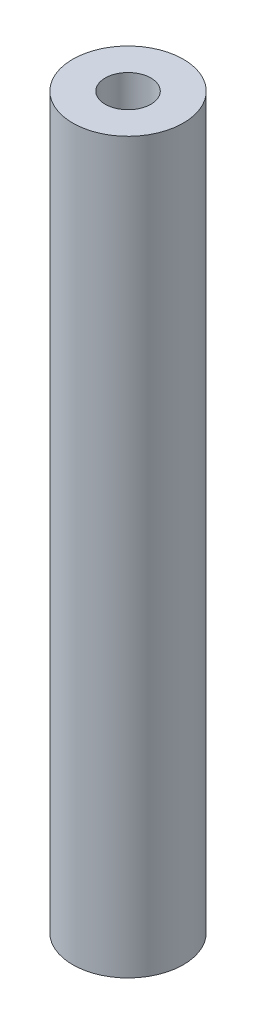
ISO-10303-21;
HEADER;
FILE_DESCRIPTION(('STEP AP214'),'2;1');
FILE_NAME('part.step','',(''),(''),'','','');
FILE_SCHEMA(('AUTOMOTIVE_DESIGN { 1 0 10303 214 1 1 1 1 }'));
ENDSEC;
DATA;
#1=APPLICATION_CONTEXT('core data for automotive mechanical design processes');
#2=APPLICATION_PROTOCOL_DEFINITION('international standard','automotive_design',2000,#1);
#3=PRODUCT_CONTEXT('',#1,'mechanical');
#4=PRODUCT('Part','Part','',(#3));
#5=PRODUCT_RELATED_PRODUCT_CATEGORY('part','',(#4));
#6=PRODUCT_DEFINITION_FORMATION('','',#4);
#7=PRODUCT_DEFINITION_CONTEXT('part definition',#1,'design');
#8=PRODUCT_DEFINITION('design','',#6,#7);
#9=PRODUCT_DEFINITION_SHAPE('','',#8);
#10=(LENGTH_UNIT() NAMED_UNIT(*) SI_UNIT(.MILLI.,.METRE.));
#11=(NAMED_UNIT(*) PLANE_ANGLE_UNIT() SI_UNIT($,.RADIAN.));
#12=(NAMED_UNIT(*) SI_UNIT($,.STERADIAN.) SOLID_ANGLE_UNIT());
#13=UNCERTAINTY_MEASURE_WITH_UNIT(LENGTH_MEASURE(1.E-05),#10,'distance_accuracy_value','');
#14=(GEOMETRIC_REPRESENTATION_CONTEXT(3) GLOBAL_UNCERTAINTY_ASSIGNED_CONTEXT((#13)) GLOBAL_UNIT_ASSIGNED_CONTEXT((#10,
#11,#12)) REPRESENTATION_CONTEXT('',''));
#15=CARTESIAN_POINT('',(0.,0.,0.));
#16=DIRECTION('',(0.,0.,1.));
#17=DIRECTION('',(1.,0.,0.));
#18=AXIS2_PLACEMENT_3D('',#15,#16,#17);
#19=CARTESIAN_POINT('',(0.,26.35,0.));
#20=DIRECTION('',(0.,-1.,0.));
#21=DIRECTION('',(0.,0.,-1.));
#22=AXIS2_PLACEMENT_3D('',#19,#20,#21);
#23=CYLINDRICAL_SURFACE('',#22,4.);
#24=CARTESIAN_POINT('',(0.,26.35,0.));
#25=DIRECTION('',(0.,1.,0.));
#26=DIRECTION('',(0.,0.,1.));
#27=AXIS2_PLACEMENT_3D('',#24,#25,#26);
#28=CIRCLE('',#27,4.);
#29=CARTESIAN_POINT('',(0.,26.35,-4.));
#30=VERTEX_POINT('',#29);
#31=EDGE_CURVE('E11',#30,#30,#28,.T.);
#32=CARTESIAN_POINT('',(0.,-26.35,0.));
#33=DIRECTION('',(0.,1.,0.));
#34=DIRECTION('',(0.,0.,1.));
#35=AXIS2_PLACEMENT_3D('',#32,#33,#34);
#36=CIRCLE('',#35,4.);
#37=CARTESIAN_POINT('',(0.,-26.35,-4.));
#38=VERTEX_POINT('',#37);
#39=EDGE_CURVE('E58',#38,#38,#36,.T.);
#40=CARTESIAN_POINT('',(0.,26.35,-4.));
#41=CARTESIAN_POINT('',(0.,25.8010416666667,-4.));
#42=CARTESIAN_POINT('',(0.,25.2520833333333,-4.));
#43=CARTESIAN_POINT('',(0.,24.1541666666667,-4.));
#44=CARTESIAN_POINT('',(0.,23.6052083333333,-4.));
#45=CARTESIAN_POINT('',(0.,22.5072916666667,-4.));
#46=CARTESIAN_POINT('',(0.,21.9583333333333,-4.));
#47=CARTESIAN_POINT('',(0.,20.8604166666667,-4.));
#48=CARTESIAN_POINT('',(0.,20.3114583333333,-4.));
#49=CARTESIAN_POINT('',(0.,19.2135416666667,-4.));
#50=CARTESIAN_POINT('',(0.,18.6645833333333,-4.));
#51=CARTESIAN_POINT('',(0.,17.5666666666667,-4.));
#52=CARTESIAN_POINT('',(0.,17.0177083333333,-4.));
#53=CARTESIAN_POINT('',(0.,15.9197916666667,-4.));
#54=CARTESIAN_POINT('',(0.,15.3708333333333,-4.));
#55=CARTESIAN_POINT('',(0.,14.2729166666667,-4.));
#56=CARTESIAN_POINT('',(0.,13.7239583333333,-4.));
#57=CARTESIAN_POINT('',(0.,12.6260416666667,-4.));
#58=CARTESIAN_POINT('',(0.,12.0770833333333,-4.));
#59=CARTESIAN_POINT('',(0.,10.9791666666667,-4.));
#60=CARTESIAN_POINT('',(0.,10.4302083333333,-4.));
#61=CARTESIAN_POINT('',(0.,9.33229166666667,-4.));
#62=CARTESIAN_POINT('',(0.,8.78333333333333,-4.));
#63=CARTESIAN_POINT('',(0.,7.68541666666667,-4.));
#64=CARTESIAN_POINT('',(0.,7.13645833333334,-4.));
#65=CARTESIAN_POINT('',(0.,6.03854166666667,-4.));
#66=CARTESIAN_POINT('',(0.,5.48958333333333,-4.));
#67=CARTESIAN_POINT('',(0.,4.39166666666667,-4.));
#68=CARTESIAN_POINT('',(0.,3.84270833333333,-4.));
#69=CARTESIAN_POINT('',(0.,2.74479166666667,-4.));
#70=CARTESIAN_POINT('',(0.,2.19583333333333,-4.));
#71=CARTESIAN_POINT('',(0.,1.09791666666667,-4.));
#72=CARTESIAN_POINT('',(0.,0.548958333333333,-4.));
#73=CARTESIAN_POINT('',(0.,-0.548958333333333,-4.));
#74=CARTESIAN_POINT('',(0.,-1.09791666666667,-4.));
#75=CARTESIAN_POINT('',(0.,-2.19583333333333,-4.));
#76=CARTESIAN_POINT('',(0.,-2.74479166666667,-4.));
#77=CARTESIAN_POINT('',(0.,-3.84270833333333,-4.));
#78=CARTESIAN_POINT('',(0.,-4.39166666666667,-4.));
#79=CARTESIAN_POINT('',(0.,-5.48958333333333,-4.));
#80=CARTESIAN_POINT('',(0.,-6.03854166666667,-4.));
#81=CARTESIAN_POINT('',(0.,-7.13645833333333,-4.));
#82=CARTESIAN_POINT('',(0.,-7.68541666666667,-4.));
#83=CARTESIAN_POINT('',(0.,-8.78333333333333,-4.));
#84=CARTESIAN_POINT('',(0.,-9.33229166666666,-4.));
#85=CARTESIAN_POINT('',(0.,-10.4302083333333,-4.));
#86=CARTESIAN_POINT('',(0.,-10.9791666666667,-4.));
#87=CARTESIAN_POINT('',(0.,-12.0770833333333,-4.));
#88=CARTESIAN_POINT('',(0.,-12.6260416666667,-4.));
#89=CARTESIAN_POINT('',(0.,-13.7239583333333,-4.));
#90=CARTESIAN_POINT('',(0.,-14.2729166666667,-4.));
#91=CARTESIAN_POINT('',(0.,-15.3708333333333,-4.));
#92=CARTESIAN_POINT('',(0.,-15.9197916666667,-4.));
#93=CARTESIAN_POINT('',(0.,-17.0177083333333,-4.));
#94=CARTESIAN_POINT('',(0.,-17.5666666666667,-4.));
#95=CARTESIAN_POINT('',(0.,-18.6645833333333,-4.));
#96=CARTESIAN_POINT('',(0.,-19.2135416666667,-4.));
#97=CARTESIAN_POINT('',(0.,-20.3114583333333,-4.));
#98=CARTESIAN_POINT('',(0.,-20.8604166666667,-4.));
#99=CARTESIAN_POINT('',(0.,-21.9583333333333,-4.));
#100=CARTESIAN_POINT('',(0.,-22.5072916666667,-4.));
#101=CARTESIAN_POINT('',(0.,-23.6052083333333,-4.));
#102=CARTESIAN_POINT('',(0.,-24.1541666666667,-4.));
#103=CARTESIAN_POINT('',(0.,-25.2520833333333,-4.));
#104=CARTESIAN_POINT('',(0.,-25.8010416666667,-4.));
#105=CARTESIAN_POINT('',(0.,-26.35,-4.));
#106=B_SPLINE_CURVE_WITH_KNOTS('',3,(#40,#41,#42,#43,#44,#45,#46,#47,#48,#49,#50,#51,#52,#53,
#54,#55,#56,#57,#58,#59,#60,#61,#62,#63,#64,#65,#66,#67,#68,#69,#70,#71,#72,#73,#74,#75,#76,#77,
#78,#79,#80,#81,#82,#83,#84,#85,#86,#87,#88,#89,#90,#91,#92,#93,#94,#95,#96,#97,#98,#99,#100,
#101,#102,#103,#104,#105),.UNSPECIFIED.,.F.,.F.,(4,2,2,2,2,2,2,2,2,2,2,2,2,2,2,2,2,2,2,2,2,2,2,
2,2,2,2,2,2,2,2,2,4),(0.,1.646875,3.29375,4.940625,6.5875,8.234375,9.88125,11.528125,13.175,
14.821875,16.46875,18.115625,19.7625,21.409375,23.05625,24.703125,26.35,27.996875,29.64375,
31.290625,32.9375,34.584375,36.23125,37.878125,39.525,41.171875,42.81875,44.465625,46.1125,
47.759375,49.40625,51.053125,52.7),.UNSPECIFIED.);
#107=EDGE_CURVE('BSEAM55',#30,#38,#106,.T.);
#108=ORIENTED_EDGE('',*,*,#31,.F.);
#109=ORIENTED_EDGE('',*,*,#39,.T.);
#110=ORIENTED_EDGE('',*,*,#107,.T.);
#111=ORIENTED_EDGE('',*,*,#107,.F.);
#112=EDGE_LOOP('',(#108,#110,#109,#111));
#113=FACE_BOUND('',#112,.T.);
#114=ADVANCED_FACE('F55',(#113),#23,.T.);
#115=CARTESIAN_POINT('',(0.,26.35,0.));
#116=DIRECTION('',(0.,1.,0.));
#117=DIRECTION('',(0.,0.,1.));
#118=AXIS2_PLACEMENT_3D('',#115,#116,#117);
#119=PLANE('',#118);
#120=CARTESIAN_POINT('',(0.,26.35,0.));
#121=DIRECTION('',(0.,1.,0.));
#122=DIRECTION('',(0.,0.,1.));
#123=AXIS2_PLACEMENT_3D('',#120,#121,#122);
#124=CIRCLE('',#123,1.64999999999999);
#125=CARTESIAN_POINT('',(0.,26.35,1.64999999999999));
#126=VERTEX_POINT('',#125);
#127=EDGE_CURVE('E80',#126,#126,#124,.T.);
#128=ORIENTED_EDGE('',*,*,#127,.F.);
#129=EDGE_LOOP('',(#128));
#130=FACE_BOUND('',#129,.T.);
#131=ORIENTED_EDGE('',*,*,#31,.T.);
#132=EDGE_LOOP('',(#131));
#133=FACE_BOUND('',#132,.T.);
#134=ADVANCED_FACE('F103',(#130,#133),#119,.T.);
#135=CARTESIAN_POINT('',(0.,-26.35,0.));
#136=DIRECTION('',(0.,1.,0.));
#137=DIRECTION('',(0.,0.,1.));
#138=AXIS2_PLACEMENT_3D('',#135,#136,#137);
#139=PLANE('',#138);
#140=CARTESIAN_POINT('',(0.,-26.35,0.));
#141=DIRECTION('',(0.,-1.,0.));
#142=DIRECTION('',(0.,0.,-1.));
#143=AXIS2_PLACEMENT_3D('',#140,#141,#142);
#144=CIRCLE('',#143,1.64999999999999);
#145=CARTESIAN_POINT('',(0.,-26.35,-1.64999999999999));
#146=VERTEX_POINT('',#145);
#147=EDGE_CURVE('E81',#146,#146,#144,.T.);
#148=ORIENTED_EDGE('',*,*,#147,.F.);
#149=EDGE_LOOP('',(#148));
#150=FACE_BOUND('',#149,.T.);
#151=ORIENTED_EDGE('',*,*,#39,.F.);
#152=EDGE_LOOP('',(#151));
#153=FACE_BOUND('',#152,.T.);
#154=ADVANCED_FACE('F100',(#150,#153),#139,.F.);
#155=CARTESIAN_POINT('',(0.,11.35,0.));
#156=DIRECTION('',(0.,1.,0.));
#157=DIRECTION('',(0.,0.,1.));
#158=AXIS2_PLACEMENT_3D('',#155,#156,#157);
#159=CONICAL_SURFACE('',#158,1.65,1.02974425867665);
#160=CARTESIAN_POINT('',(0.,10.3585799786045,0.));
#161=VERTEX_POINT('',#160);
#162=VERTEX_LOOP('',#161);
#163=FACE_BOUND('',#162,.T.);
#164=CARTESIAN_POINT('',(0.,11.35,0.));
#165=DIRECTION('',(0.,1.,0.));
#166=DIRECTION('',(0.,0.,1.));
#167=AXIS2_PLACEMENT_3D('',#164,#165,#166);
#168=CIRCLE('',#167,1.65);
#169=CARTESIAN_POINT('',(0.,11.35,1.65));
#170=VERTEX_POINT('',#169);
#171=EDGE_CURVE('E86',#170,#170,#168,.T.);
#172=ORIENTED_EDGE('',*,*,#171,.T.);
#173=EDGE_LOOP('',(#172));
#174=FACE_BOUND('',#173,.T.);
#175=ADVANCED_FACE('F102',(#163,#174),#159,.F.);
#176=CARTESIAN_POINT('',(0.,26.35,0.));
#177=DIRECTION('',(0.,1.,0.));
#178=DIRECTION('',(0.,0.,1.));
#179=AXIS2_PLACEMENT_3D('',#176,#177,#178);
#180=CYLINDRICAL_SURFACE('',#179,1.64999999999999);
#181=ORIENTED_EDGE('',*,*,#171,.F.);
#182=EDGE_LOOP('',(#181));
#183=FACE_BOUND('',#182,.T.);
#184=ORIENTED_EDGE('',*,*,#127,.T.);
#185=EDGE_LOOP('',(#184));
#186=FACE_BOUND('',#185,.T.);
#187=ADVANCED_FACE('F73',(#183,#186),#180,.F.);
#188=CARTESIAN_POINT('',(0.,-11.35,0.));
#189=DIRECTION('',(0.,-1.,0.));
#190=DIRECTION('',(0.,0.,-1.));
#191=AXIS2_PLACEMENT_3D('',#188,#189,#190);
#192=CONICAL_SURFACE('',#191,1.64999999999999,1.02974425867665);
#193=CARTESIAN_POINT('',(0.,-10.3585799786045,0.));
#194=VERTEX_POINT('',#193);
#195=VERTEX_LOOP('',#194);
#196=FACE_BOUND('',#195,.T.);
#197=CARTESIAN_POINT('',(0.,-11.35,0.));
#198=DIRECTION('',(0.,-1.,0.));
#199=DIRECTION('',(0.,0.,-1.));
#200=AXIS2_PLACEMENT_3D('',#197,#198,#199);
#201=CIRCLE('',#200,1.64999999999999);
#202=CARTESIAN_POINT('',(0.,-11.35,-1.64999999999999));
#203=VERTEX_POINT('',#202);
#204=EDGE_CURVE('E77',#203,#203,#201,.T.);
#205=ORIENTED_EDGE('',*,*,#204,.T.);
#206=EDGE_LOOP('',(#205));
#207=FACE_BOUND('',#206,.T.);
#208=ADVANCED_FACE('F69',(#196,#207),#192,.F.);
#209=CARTESIAN_POINT('',(0.,-26.35,0.));
#210=DIRECTION('',(0.,-1.,0.));
#211=DIRECTION('',(0.,0.,-1.));
#212=AXIS2_PLACEMENT_3D('',#209,#210,#211);
#213=CYLINDRICAL_SURFACE('',#212,1.64999999999999);
#214=ORIENTED_EDGE('',*,*,#204,.F.);
#215=EDGE_LOOP('',(#214));
#216=FACE_BOUND('',#215,.T.);
#217=ORIENTED_EDGE('',*,*,#147,.T.);
#218=EDGE_LOOP('',(#217));
#219=FACE_BOUND('',#218,.T.);
#220=ADVANCED_FACE('F72',(#216,#219),#213,.F.);
#221=CLOSED_SHELL('',(#114,#134,#154,#175,#187,#208,#220));
#222=MANIFOLD_SOLID_BREP('B2',#221);
#223=ADVANCED_BREP_SHAPE_REPRESENTATION('',(#18,#222),#14);
#224=SHAPE_DEFINITION_REPRESENTATION(#9,#223);
ENDSEC;
END-ISO-10303-21;
